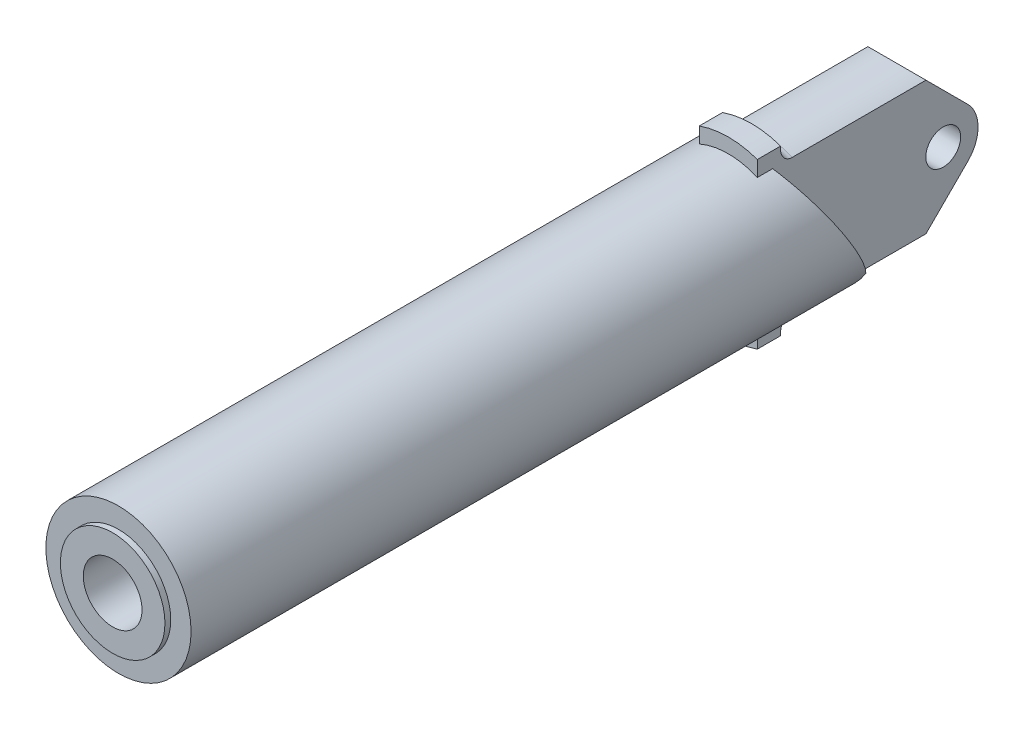
ISO-10303-21;
HEADER;
FILE_DESCRIPTION(('STEP AP214'),'2;1');
FILE_NAME('part.step','',(''),(''),'','','');
FILE_SCHEMA(('AUTOMOTIVE_DESIGN { 1 0 10303 214 1 1 1 1 }'));
ENDSEC;
DATA;
#1=APPLICATION_CONTEXT('core data for automotive mechanical design processes');
#2=APPLICATION_PROTOCOL_DEFINITION('international standard','automotive_design',2000,#1);
#3=PRODUCT_CONTEXT('',#1,'mechanical');
#4=PRODUCT('Part','Part','',(#3));
#5=PRODUCT_RELATED_PRODUCT_CATEGORY('part','',(#4));
#6=PRODUCT_DEFINITION_FORMATION('','',#4);
#7=PRODUCT_DEFINITION_CONTEXT('part definition',#1,'design');
#8=PRODUCT_DEFINITION('design','',#6,#7);
#9=PRODUCT_DEFINITION_SHAPE('','',#8);
#10=(LENGTH_UNIT() NAMED_UNIT(*) SI_UNIT(.MILLI.,.METRE.));
#11=(NAMED_UNIT(*) PLANE_ANGLE_UNIT() SI_UNIT($,.RADIAN.));
#12=(NAMED_UNIT(*) SI_UNIT($,.STERADIAN.) SOLID_ANGLE_UNIT());
#13=UNCERTAINTY_MEASURE_WITH_UNIT(LENGTH_MEASURE(1.E-05),#10,'distance_accuracy_value','');
#14=(GEOMETRIC_REPRESENTATION_CONTEXT(3) GLOBAL_UNCERTAINTY_ASSIGNED_CONTEXT((#13)) GLOBAL_UNIT_ASSIGNED_CONTEXT((#10,
#11,#12)) REPRESENTATION_CONTEXT('',''));
#15=CARTESIAN_POINT('',(0.,0.,0.));
#16=DIRECTION('',(0.,0.,1.));
#17=DIRECTION('',(1.,0.,0.));
#18=AXIS2_PLACEMENT_3D('',#15,#16,#17);
#19=CARTESIAN_POINT('',(0.,0.,34.0000000030045));
#20=DIRECTION('',(0.,0.,1.));
#21=DIRECTION('',(1.,0.,0.));
#22=AXIS2_PLACEMENT_3D('',#19,#20,#21);
#23=CONICAL_SURFACE('',#22,5.05299999827002,1.02974425750642);
#24=CARTESIAN_POINT('',(0.,0.,30.9638512880497));
#25=VERTEX_POINT('',#24);
#26=VERTEX_LOOP('',#25);
#27=FACE_BOUND('',#26,.T.);
#28=CARTESIAN_POINT('',(0.,0.,34.));
#29=DIRECTION('',(0.,0.,1.));
#30=DIRECTION('',(1.,0.,0.));
#31=AXIS2_PLACEMENT_3D('',#28,#29,#30);
#32=CIRCLE('',#31,5.053);
#33=CARTESIAN_POINT('',(5.053,0.,34.));
#34=VERTEX_POINT('',#33);
#35=EDGE_CURVE('E324',#34,#34,#32,.T.);
#36=ORIENTED_EDGE('',*,*,#35,.T.);
#37=EDGE_LOOP('',(#36));
#38=FACE_BOUND('',#37,.T.);
#39=ADVANCED_FACE('F17',(#27,#38),#23,.F.);
#40=CARTESIAN_POINT('',(0.,0.,89.));
#41=DIRECTION('',(0.,0.,1.));
#42=DIRECTION('',(1.,0.,0.));
#43=AXIS2_PLACEMENT_3D('',#40,#41,#42);
#44=CYLINDRICAL_SURFACE('',#43,5.053);
#45=ORIENTED_EDGE('',*,*,#35,.F.);
#46=EDGE_LOOP('',(#45));
#47=FACE_BOUND('',#46,.T.);
#48=CARTESIAN_POINT('',(0.,0.,144.));
#49=DIRECTION('',(0.,0.,1.));
#50=DIRECTION('',(1.,0.,0.));
#51=AXIS2_PLACEMENT_3D('',#48,#49,#50);
#52=CIRCLE('',#51,5.053);
#53=CARTESIAN_POINT('',(5.053,0.,144.));
#54=VERTEX_POINT('',#53);
#55=EDGE_CURVE('E20',#54,#54,#52,.T.);
#56=ORIENTED_EDGE('',*,*,#55,.T.);
#57=EDGE_LOOP('',(#56));
#58=FACE_BOUND('',#57,.T.);
#59=ADVANCED_FACE('F337',(#47,#58),#44,.F.);
#60=CARTESIAN_POINT('',(0.,0.,144.));
#61=DIRECTION('',(0.,0.,-1.));
#62=DIRECTION('',(-1.,0.,0.));
#63=AXIS2_PLACEMENT_3D('',#60,#61,#62);
#64=PLANE('',#63);
#65=ORIENTED_EDGE('',*,*,#55,.F.);
#66=EDGE_LOOP('',(#65));
#67=FACE_BOUND('',#66,.T.);
#68=CARTESIAN_POINT('',(0.,0.,144.));
#69=DIRECTION('',(0.,0.,1.));
#70=DIRECTION('',(1.,0.,0.));
#71=AXIS2_PLACEMENT_3D('',#68,#69,#70);
#72=CIRCLE('',#71,9.);
#73=CARTESIAN_POINT('',(9.,0.,144.));
#74=VERTEX_POINT('',#73);
#75=EDGE_CURVE('E293',#74,#74,#72,.F.);
#76=ORIENTED_EDGE('',*,*,#75,.F.);
#77=EDGE_LOOP('',(#76));
#78=FACE_BOUND('',#77,.T.);
#79=ADVANCED_FACE('F339',(#67,#78),#64,.F.);
#80=CARTESIAN_POINT('',(0.,13.2455290355381,34.));
#81=DIRECTION('',(0.,0.,1.));
#82=DIRECTION('',(1.,0.,0.));
#83=AXIS2_PLACEMENT_3D('',#80,#81,#82);
#84=PLANE('',#83);
#85=DIRECTION('',(0.,1.,0.));
#86=VECTOR('',#85,1.);
#87=CARTESIAN_POINT('',(-5.,13.2455290355381,34.));
#88=LINE('',#87,#86);
#89=CARTESIAN_POINT('',(-5.,14.1421356237309,34.));
#90=VERTEX_POINT('',#89);
#91=CARTESIAN_POINT('',(-5.,13.6106575888162,34.));
#92=VERTEX_POINT('',#91);
#93=EDGE_CURVE('E295',#90,#92,#88,.F.);
#94=ORIENTED_EDGE('',*,*,#93,.F.);
#95=CARTESIAN_POINT('',(0.,0.,34.));
#96=DIRECTION('',(0.,0.,-1.));
#97=DIRECTION('',(-1.,0.,0.));
#98=AXIS2_PLACEMENT_3D('',#95,#96,#97);
#99=CIRCLE('',#98,15.);
#100=CARTESIAN_POINT('',(5.,14.1421356237309,34.));
#101=VERTEX_POINT('',#100);
#102=EDGE_CURVE('E289',#101,#90,#99,.F.);
#103=ORIENTED_EDGE('',*,*,#102,.F.);
#104=DIRECTION('',(0.,1.,0.));
#105=VECTOR('',#104,1.);
#106=CARTESIAN_POINT('',(5.,13.2455290355381,34.));
#107=LINE('',#106,#105);
#108=CARTESIAN_POINT('',(5.,13.6106575888162,34.));
#109=VERTEX_POINT('',#108);
#110=EDGE_CURVE('E299',#109,#101,#107,.T.);
#111=ORIENTED_EDGE('',*,*,#110,.F.);
#112=CARTESIAN_POINT('',(0.,0.,34.));
#113=DIRECTION('',(0.,0.,-1.));
#114=DIRECTION('',(-0.344827586206896,0.938666040608014,0.));
#115=AXIS2_PLACEMENT_3D('',#112,#113,#114);
#116=CIRCLE('',#115,14.5);
#117=EDGE_CURVE('E292',#109,#92,#116,.F.);
#118=ORIENTED_EDGE('',*,*,#117,.T.);
#119=EDGE_LOOP('',(#94,#103,#111,#118));
#120=FACE_BOUND('',#119,.T.);
#121=ADVANCED_FACE('F342',(#120),#84,.F.);
#122=CARTESIAN_POINT('',(0.,0.,143.));
#123=DIRECTION('',(0.,0.,1.));
#124=DIRECTION('',(1.,0.,0.));
#125=AXIS2_PLACEMENT_3D('',#122,#123,#124);
#126=CYLINDRICAL_SURFACE('',#125,9.);
#127=CARTESIAN_POINT('',(0.,0.,143.));
#128=DIRECTION('',(0.,0.,1.));
#129=DIRECTION('',(1.,0.,0.));
#130=AXIS2_PLACEMENT_3D('',#127,#128,#129);
#131=CIRCLE('',#130,9.);
#132=CARTESIAN_POINT('',(9.,0.,143.));
#133=VERTEX_POINT('',#132);
#134=EDGE_CURVE('E282',#133,#133,#131,.T.);
#135=ORIENTED_EDGE('',*,*,#134,.T.);
#136=EDGE_LOOP('',(#135));
#137=FACE_BOUND('',#136,.T.);
#138=ORIENTED_EDGE('',*,*,#75,.T.);
#139=EDGE_LOOP('',(#138));
#140=FACE_BOUND('',#139,.T.);
#141=ADVANCED_FACE('F349',(#137,#140),#126,.T.);
#142=CARTESIAN_POINT('',(0.,0.,38.));
#143=DIRECTION('',(0.,0.,-1.));
#144=DIRECTION('',(-1.,0.,0.));
#145=AXIS2_PLACEMENT_3D('',#142,#143,#144);
#146=CYLINDRICAL_SURFACE('',#145,15.);
#147=CARTESIAN_POINT('',(0.,0.,38.));
#148=DIRECTION('',(0.,0.,-1.));
#149=DIRECTION('',(-1.,0.,0.));
#150=AXIS2_PLACEMENT_3D('',#147,#148,#149);
#151=CIRCLE('',#150,15.);
#152=CARTESIAN_POINT('',(-5.,-14.1421356237309,38.));
#153=VERTEX_POINT('',#152);
#154=CARTESIAN_POINT('',(5.,-14.1421356237309,38.));
#155=VERTEX_POINT('',#154);
#156=EDGE_CURVE('E278',#153,#155,#151,.F.);
#157=ORIENTED_EDGE('',*,*,#156,.F.);
#158=DIRECTION('',(0.,0.,1.));
#159=VECTOR('',#158,1.);
#160=CARTESIAN_POINT('',(-5.,-14.1421356237309,38.));
#161=LINE('',#160,#159);
#162=CARTESIAN_POINT('',(-5.,-14.1421356237309,34.));
#163=VERTEX_POINT('',#162);
#164=EDGE_CURVE('E594',#163,#153,#161,.T.);
#165=ORIENTED_EDGE('',*,*,#164,.F.);
#166=CARTESIAN_POINT('',(0.,0.,34.));
#167=DIRECTION('',(0.,0.,-1.));
#168=DIRECTION('',(-1.,0.,0.));
#169=AXIS2_PLACEMENT_3D('',#166,#167,#168);
#170=CIRCLE('',#169,15.);
#171=CARTESIAN_POINT('',(5.,-14.1421356237309,34.));
#172=VERTEX_POINT('',#171);
#173=EDGE_CURVE('E129',#163,#172,#170,.F.);
#174=ORIENTED_EDGE('',*,*,#173,.T.);
#175=DIRECTION('',(0.,0.,-1.));
#176=VECTOR('',#175,1.);
#177=CARTESIAN_POINT('',(5.,-14.1421356237309,38.));
#178=LINE('',#177,#176);
#179=EDGE_CURVE('E585',#155,#172,#178,.T.);
#180=ORIENTED_EDGE('',*,*,#179,.F.);
#181=EDGE_LOOP('',(#157,#165,#174,#180));
#182=FACE_BOUND('',#181,.T.);
#183=ADVANCED_FACE('F469',(#182),#146,.T.);
#184=CARTESIAN_POINT('',(0.,-13.2455290355381,34.));
#185=DIRECTION('',(0.,0.,1.));
#186=DIRECTION('',(1.,0.,0.));
#187=AXIS2_PLACEMENT_3D('',#184,#185,#186);
#188=PLANE('',#187);
#189=DIRECTION('',(0.,1.,0.));
#190=VECTOR('',#189,1.);
#191=CARTESIAN_POINT('',(5.,-14.1421356237309,34.));
#192=LINE('',#191,#190);
#193=CARTESIAN_POINT('',(5.,-13.6106575888162,34.));
#194=VERTEX_POINT('',#193);
#195=EDGE_CURVE('E280',#172,#194,#192,.T.);
#196=ORIENTED_EDGE('',*,*,#195,.F.);
#197=ORIENTED_EDGE('',*,*,#173,.F.);
#198=DIRECTION('',(0.,1.,0.));
#199=VECTOR('',#198,1.);
#200=CARTESIAN_POINT('',(-5.,-11.4564392373896,34.));
#201=LINE('',#200,#199);
#202=CARTESIAN_POINT('',(-5.,-13.6106575888162,34.));
#203=VERTEX_POINT('',#202);
#204=EDGE_CURVE('E285',#203,#163,#201,.F.);
#205=ORIENTED_EDGE('',*,*,#204,.F.);
#206=CARTESIAN_POINT('',(0.,0.,34.));
#207=DIRECTION('',(0.,0.,-1.));
#208=DIRECTION('',(0.344827586206897,-0.938666040608014,0.));
#209=AXIS2_PLACEMENT_3D('',#206,#207,#208);
#210=CIRCLE('',#209,14.5);
#211=EDGE_CURVE('E243',#203,#194,#210,.F.);
#212=ORIENTED_EDGE('',*,*,#211,.T.);
#213=EDGE_LOOP('',(#196,#197,#205,#212));
#214=FACE_BOUND('',#213,.T.);
#215=ADVANCED_FACE('F461',(#214),#188,.F.);
#216=CARTESIAN_POINT('',(0.,0.,6.));
#217=DIRECTION('',(1.,0.,0.));
#218=DIRECTION('',(0.,0.,-1.));
#219=AXIS2_PLACEMENT_3D('',#216,#217,#218);
#220=CYLINDRICAL_SURFACE('',#219,5.99999999999999);
#221=CARTESIAN_POINT('',(5.,0.,6.));
#222=DIRECTION('',(1.,0.,0.));
#223=DIRECTION('',(0.,0.,-1.));
#224=AXIS2_PLACEMENT_3D('',#221,#222,#223);
#225=CIRCLE('',#224,5.99999999999999);
#226=CARTESIAN_POINT('',(5.,4.24264068711928,1.75735931288071));
#227=VERTEX_POINT('',#226);
#228=CARTESIAN_POINT('',(5.,-4.24264068711928,1.75735931288072));
#229=VERTEX_POINT('',#228);
#230=EDGE_CURVE('E203',#227,#229,#225,.F.);
#231=ORIENTED_EDGE('',*,*,#230,.T.);
#232=DIRECTION('',(1.,0.,0.));
#233=VECTOR('',#232,1.);
#234=CARTESIAN_POINT('',(0.,-4.24264068711927,1.75735931288072));
#235=LINE('',#234,#233);
#236=CARTESIAN_POINT('',(-5.,-4.24264068711927,1.75735931288072));
#237=VERTEX_POINT('',#236);
#238=EDGE_CURVE('E649',#229,#237,#235,.F.);
#239=ORIENTED_EDGE('',*,*,#238,.T.);
#240=CARTESIAN_POINT('',(-5.,0.,6.));
#241=DIRECTION('',(1.,0.,0.));
#242=DIRECTION('',(0.,0.,-1.));
#243=AXIS2_PLACEMENT_3D('',#240,#241,#242);
#244=CIRCLE('',#243,5.99999999999999);
#245=CARTESIAN_POINT('',(-5.,4.24264068711928,1.75735931288071));
#246=VERTEX_POINT('',#245);
#247=EDGE_CURVE('E612',#237,#246,#244,.T.);
#248=ORIENTED_EDGE('',*,*,#247,.T.);
#249=DIRECTION('',(1.,0.,0.));
#250=VECTOR('',#249,1.);
#251=CARTESIAN_POINT('',(0.,4.24264068711928,1.75735931288071));
#252=LINE('',#251,#250);
#253=EDGE_CURVE('E288',#246,#227,#252,.T.);
#254=ORIENTED_EDGE('',*,*,#253,.T.);
#255=EDGE_LOOP('',(#231,#239,#248,#254));
#256=FACE_BOUND('',#255,.T.);
#257=ADVANCED_FACE('F454',(#256),#220,.T.);
#258=CARTESIAN_POINT('',(0.,0.,38.));
#259=DIRECTION('',(0.,0.,-1.));
#260=DIRECTION('',(-1.,0.,0.));
#261=AXIS2_PLACEMENT_3D('',#258,#259,#260);
#262=CYLINDRICAL_SURFACE('',#261,15.);
#263=CARTESIAN_POINT('',(0.,0.,38.));
#264=DIRECTION('',(0.,0.,-1.));
#265=DIRECTION('',(-1.,0.,0.));
#266=AXIS2_PLACEMENT_3D('',#263,#264,#265);
#267=CIRCLE('',#266,15.);
#268=CARTESIAN_POINT('',(5.,14.1421356237309,38.));
#269=VERTEX_POINT('',#268);
#270=CARTESIAN_POINT('',(-5.,14.1421356237309,38.));
#271=VERTEX_POINT('',#270);
#272=EDGE_CURVE('E237',#269,#271,#267,.F.);
#273=ORIENTED_EDGE('',*,*,#272,.F.);
#274=DIRECTION('',(0.,0.,1.));
#275=VECTOR('',#274,1.);
#276=CARTESIAN_POINT('',(5.,14.1421356237309,0.));
#277=LINE('',#276,#275);
#278=EDGE_CURVE('E195',#269,#101,#277,.F.);
#279=ORIENTED_EDGE('',*,*,#278,.T.);
#280=ORIENTED_EDGE('',*,*,#102,.T.);
#281=DIRECTION('',(0.,0.,-1.));
#282=VECTOR('',#281,1.);
#283=CARTESIAN_POINT('',(-5.,14.1421356237309,0.));
#284=LINE('',#283,#282);
#285=EDGE_CURVE('E601',#90,#271,#284,.F.);
#286=ORIENTED_EDGE('',*,*,#285,.T.);
#287=EDGE_LOOP('',(#273,#279,#280,#286));
#288=FACE_BOUND('',#287,.T.);
#289=ADVANCED_FACE('F448',(#288),#262,.T.);
#290=CARTESIAN_POINT('',(0.,0.,32.));
#291=DIRECTION('',(0.,0.,-1.));
#292=DIRECTION('',(-1.,0.,0.));
#293=AXIS2_PLACEMENT_3D('',#290,#291,#292);
#294=TOROIDAL_SURFACE('',#293,14.5,2.);
#295=ORIENTED_EDGE('',*,*,#117,.F.);
#296=CARTESIAN_POINT('',(5.,13.6106575888162,34.));
#297=CARTESIAN_POINT('',(5.,13.5468966708527,33.9999975430048));
#298=CARTESIAN_POINT('',(5.,13.4831675691273,33.9973121061018));
#299=CARTESIAN_POINT('',(5.,13.3561587571479,33.9866120732048));
#300=CARTESIAN_POINT('',(5.,13.2928790434602,33.9785975179741));
#301=CARTESIAN_POINT('',(5.,13.1043019111399,33.9466171384072));
#302=CARTESIAN_POINT('',(5.,12.9802554517371,33.9147145871028));
#303=CARTESIAN_POINT('',(5.,12.7392624356457,33.8304773346133));
#304=CARTESIAN_POINT('',(5.,12.6223208220204,33.7781285922937));
#305=CARTESIAN_POINT('',(5.,12.3991818269657,33.6541040620615));
#306=CARTESIAN_POINT('',(5.,12.2929794970167,33.5824372319874));
#307=CARTESIAN_POINT('',(5.,12.0973417479164,33.4232624221871));
#308=CARTESIAN_POINT('',(5.,12.0075673313835,33.3361722247259));
#309=CARTESIAN_POINT('',(5.,11.8452400671224,33.1471133692669));
#310=CARTESIAN_POINT('',(5.,11.7726849924521,33.0451466379778));
#311=CARTESIAN_POINT('',(5.,11.6525767852514,32.8369316825648));
#312=CARTESIAN_POINT('',(5.,11.60362238728,32.7314911511406));
#313=CARTESIAN_POINT('',(5.,11.5258794089757,32.513508331409));
#314=CARTESIAN_POINT('',(5.,11.497052280248,32.4009800711125));
#315=CARTESIAN_POINT('',(5.,11.4714946535357,32.2394281899142));
#316=CARTESIAN_POINT('',(5.,11.4658511099785,32.1916842418682));
#317=CARTESIAN_POINT('',(5.,11.4583267383209,32.0959690262795));
#318=CARTESIAN_POINT('',(5.,11.4564405796231,32.0479981776969));
#319=CARTESIAN_POINT('',(5.,11.4564392373896,32.));
#320=B_SPLINE_CURVE_WITH_KNOTS('',3,(#296,#297,#298,#299,#300,#301,#302,#303,#304,#305,#306,
#307,#308,#309,#310,#311,#312,#313,#314,#315,#316,#317,#318,#319),.UNSPECIFIED.,.F.,.F.,(4,2,2,
2,2,2,2,2,2,2,2,4),(0.,0.191163730210204,0.382325998195225,0.764617801777558,1.14717260180131,
1.52955031460135,1.90282410237363,2.27604958907835,2.62298174064204,2.96924760029805,
3.11335567204701,3.25725915182686),.UNSPECIFIED.);
#321=CARTESIAN_POINT('',(5.,11.4564392373896,32.));
#322=VERTEX_POINT('',#321);
#323=EDGE_CURVE('E192',#109,#322,#320,.T.);
#324=ORIENTED_EDGE('',*,*,#323,.T.);
#325=CARTESIAN_POINT('',(0.,0.,32.));
#326=DIRECTION('',(0.,0.,1.));
#327=DIRECTION('',(1.,0.,0.));
#328=AXIS2_PLACEMENT_3D('',#325,#326,#327);
#329=CIRCLE('',#328,12.5);
#330=CARTESIAN_POINT('',(-5.,11.4564392373896,32.));
#331=VERTEX_POINT('',#330);
#332=EDGE_CURVE('E597',#331,#322,#329,.F.);
#333=ORIENTED_EDGE('',*,*,#332,.F.);
#334=CARTESIAN_POINT('',(-5.,11.4564392373896,32.));
#335=CARTESIAN_POINT('',(-5.,11.4564304085411,32.0530346313303));
#336=CARTESIAN_POINT('',(-5.,11.458740702365,32.106064923116));
#337=CARTESIAN_POINT('',(-5.,11.4679317672374,32.2117152954959));
#338=CARTESIAN_POINT('',(-5.,11.4748114160961,32.2643354736005));
#339=CARTESIAN_POINT('',(-5.,11.4930444847472,32.3686246369326));
#340=CARTESIAN_POINT('',(-5.,11.504383626757,32.4202961123279));
#341=CARTESIAN_POINT('',(-5.,11.5313978396076,32.5224792645873));
#342=CARTESIAN_POINT('',(-5.,11.5470730288118,32.57299090975));
#343=CARTESIAN_POINT('',(-5.,11.600355201599,32.7222137935305));
#344=CARTESIAN_POINT('',(-5.,11.6442446276126,32.8187581715649));
#345=CARTESIAN_POINT('',(-5.,11.7470204492462,33.0034595344621));
#346=CARTESIAN_POINT('',(-5.,11.8059151353975,33.0916118455325));
#347=CARTESIAN_POINT('',(-5.,11.9391480857162,33.260809356467));
#348=CARTESIAN_POINT('',(-5.,12.0139839333843,33.3414624932931));
#349=CARTESIAN_POINT('',(-5.,12.1752540492434,33.4901705289463));
#350=CARTESIAN_POINT('',(-5.,12.2616918333641,33.5582215938207));
#351=CARTESIAN_POINT('',(-5.,12.4508895204671,33.6853271844896));
#352=CARTESIAN_POINT('',(-5.,12.5543959908048,33.7432705544042));
#353=CARTESIAN_POINT('',(-5.,12.769255783192,33.8421200577179));
#354=CARTESIAN_POINT('',(-5.,12.8806107829497,33.883022535449));
#355=CARTESIAN_POINT('',(-5.,13.0946290904793,33.9431827390289));
#356=CARTESIAN_POINT('',(-5.,13.1967345119595,33.9644471168061));
#357=CARTESIAN_POINT('',(-5.,13.4027717958483,33.9928590281403));
#358=CARTESIAN_POINT('',(-5.,13.5067014566854,34.0000225365941));
#359=CARTESIAN_POINT('',(-5.,13.6106575888162,34.));
#360=B_SPLINE_CURVE_WITH_KNOTS('',3,(#334,#335,#336,#337,#338,#339,#340,#341,#342,#343,#344,
#345,#346,#347,#348,#349,#350,#351,#352,#353,#354,#355,#356,#357,#358,#359),.UNSPECIFIED.,.F.,
.F.,(4,2,2,2,2,2,2,2,2,2,2,2,4),(0.,0.15904623246959,0.318053419143773,0.476555609864902,
0.635062127733801,0.95163834159218,1.26838984719524,1.59705603867599,1.92582205722875,
2.28015470514148,2.63456332656375,2.94649450248333,3.25807208723595),.UNSPECIFIED.);
#361=EDGE_CURVE('E235',#331,#92,#360,.T.);
#362=ORIENTED_EDGE('',*,*,#361,.T.);
#363=EDGE_LOOP('',(#295,#324,#333,#362));
#364=FACE_BOUND('',#363,.T.);
#365=ADVANCED_FACE('F205',(#364),#294,.F.);
#366=CARTESIAN_POINT('',(0.,0.,0.));
#367=DIRECTION('',(0.,0.,1.));
#368=DIRECTION('',(1.,0.,0.));
#369=AXIS2_PLACEMENT_3D('',#366,#367,#368);
#370=CYLINDRICAL_SURFACE('',#369,12.5);
#371=CARTESIAN_POINT('',(0.,0.,-2.48528137423858));
#372=DIRECTION('',(0.,-0.707106781186548,0.707106781186547));
#373=DIRECTION('',(0.,0.707106781186547,0.707106781186548));
#374=AXIS2_PLACEMENT_3D('',#371,#372,#373);
#375=ELLIPSE('',#374,17.6776695296637,12.5);
#376=CARTESIAN_POINT('',(5.,11.4564392373896,8.97115786315104));
#377=VERTEX_POINT('',#376);
#378=CARTESIAN_POINT('',(-5.,11.4564392373896,8.97115786315104));
#379=VERTEX_POINT('',#378);
#380=EDGE_CURVE('E286',#377,#379,#375,.T.);
#381=ORIENTED_EDGE('',*,*,#380,.T.);
#382=DIRECTION('',(0.,0.,-1.));
#383=VECTOR('',#382,1.);
#384=CARTESIAN_POINT('',(-5.,11.4564392373896,0.));
#385=LINE('',#384,#383);
#386=EDGE_CURVE('E602',#379,#331,#385,.F.);
#387=ORIENTED_EDGE('',*,*,#386,.T.);
#388=ORIENTED_EDGE('',*,*,#332,.T.);
#389=DIRECTION('',(0.,0.,1.));
#390=VECTOR('',#389,1.);
#391=CARTESIAN_POINT('',(5.,11.4564392373896,0.));
#392=LINE('',#391,#390);
#393=EDGE_CURVE('E194',#322,#377,#392,.F.);
#394=ORIENTED_EDGE('',*,*,#393,.T.);
#395=EDGE_LOOP('',(#381,#387,#388,#394));
#396=FACE_BOUND('',#395,.T.);
#397=ADVANCED_FACE('F434',(#396),#370,.T.);
#398=CARTESIAN_POINT('',(0.,4.24264068711928,1.75735931288071));
#399=DIRECTION('',(0.,-0.707106781186548,0.707106781186547));
#400=DIRECTION('',(0.,-0.707106781186547,-0.707106781186548));
#401=AXIS2_PLACEMENT_3D('',#398,#399,#400);
#402=PLANE('',#401);
#403=ORIENTED_EDGE('',*,*,#380,.F.);
#404=DIRECTION('',(0.,-0.707106781186547,-0.707106781186547));
#405=VECTOR('',#404,1.);
#406=CARTESIAN_POINT('',(5.,11.4564392373896,8.97115786315103));
#407=LINE('',#406,#405);
#408=EDGE_CURVE('E191',#377,#227,#407,.T.);
#409=ORIENTED_EDGE('',*,*,#408,.T.);
#410=ORIENTED_EDGE('',*,*,#253,.F.);
#411=DIRECTION('',(0.,0.707106781186548,0.707106781186548));
#412=VECTOR('',#411,1.);
#413=CARTESIAN_POINT('',(-5.,4.24264068711928,1.75735931288071));
#414=LINE('',#413,#412);
#415=EDGE_CURVE('E608',#246,#379,#414,.T.);
#416=ORIENTED_EDGE('',*,*,#415,.T.);
#417=EDGE_LOOP('',(#403,#409,#410,#416));
#418=FACE_BOUND('',#417,.T.);
#419=ADVANCED_FACE('F427',(#418),#402,.F.);
#420=CARTESIAN_POINT('',(142.305804366291,0.,6.));
#421=DIRECTION('',(-1.,0.,0.));
#422=DIRECTION('',(0.,-1.,0.));
#423=AXIS2_PLACEMENT_3D('',#420,#421,#422);
#424=CYLINDRICAL_SURFACE('',#423,3.);
#425=CARTESIAN_POINT('',(-5.,0.,6.));
#426=DIRECTION('',(-1.,0.,0.));
#427=DIRECTION('',(0.,-1.,0.));
#428=AXIS2_PLACEMENT_3D('',#425,#426,#427);
#429=CIRCLE('',#428,3.);
#430=CARTESIAN_POINT('',(-5.00000000000001,-3.,6.));
#431=VERTEX_POINT('',#430);
#432=EDGE_CURVE('E651',#431,#431,#429,.T.);
#433=ORIENTED_EDGE('',*,*,#432,.T.);
#434=EDGE_LOOP('',(#433));
#435=FACE_BOUND('',#434,.T.);
#436=CARTESIAN_POINT('',(5.,0.,6.));
#437=DIRECTION('',(-1.,0.,0.));
#438=DIRECTION('',(0.,-1.,0.));
#439=AXIS2_PLACEMENT_3D('',#436,#437,#438);
#440=CIRCLE('',#439,3.);
#441=CARTESIAN_POINT('',(5.,-3.,6.));
#442=VERTEX_POINT('',#441);
#443=EDGE_CURVE('E188',#442,#442,#440,.F.);
#444=ORIENTED_EDGE('',*,*,#443,.T.);
#445=EDGE_LOOP('',(#444));
#446=FACE_BOUND('',#445,.T.);
#447=ADVANCED_FACE('F420',(#435,#446),#424,.F.);
#448=CARTESIAN_POINT('',(0.,0.,143.));
#449=DIRECTION('',(0.,0.,-1.));
#450=DIRECTION('',(-1.,0.,0.));
#451=AXIS2_PLACEMENT_3D('',#448,#449,#450);
#452=PLANE('',#451);
#453=ORIENTED_EDGE('',*,*,#134,.F.);
#454=EDGE_LOOP('',(#453));
#455=FACE_BOUND('',#454,.T.);
#456=CARTESIAN_POINT('',(0.,0.,143.));
#457=DIRECTION('',(0.,0.,1.));
#458=DIRECTION('',(1.,0.,0.));
#459=AXIS2_PLACEMENT_3D('',#456,#457,#458);
#460=CIRCLE('',#459,12.5);
#461=CARTESIAN_POINT('',(12.5,0.,143.));
#462=VERTEX_POINT('',#461);
#463=EDGE_CURVE('E185',#462,#462,#460,.F.);
#464=ORIENTED_EDGE('',*,*,#463,.F.);
#465=EDGE_LOOP('',(#464));
#466=FACE_BOUND('',#465,.T.);
#467=ADVANCED_FACE('F270',(#455,#466),#452,.F.);
#468=CARTESIAN_POINT('',(-5.,-11.4564392373896,38.));
#469=DIRECTION('',(-1.,0.,0.));
#470=DIRECTION('',(0.,0.,1.));
#471=AXIS2_PLACEMENT_3D('',#468,#469,#470);
#472=PLANE('',#471);
#473=DIRECTION('',(0.,0.,1.));
#474=VECTOR('',#473,1.);
#475=CARTESIAN_POINT('',(-5.,-11.4564392373896,0.));
#476=LINE('',#475,#474);
#477=CARTESIAN_POINT('',(-5.,-11.4564392373896,32.));
#478=VERTEX_POINT('',#477);
#479=CARTESIAN_POINT('',(-5.,-11.4564392373896,38.));
#480=VERTEX_POINT('',#479);
#481=EDGE_CURVE('E184',#478,#480,#476,.T.);
#482=ORIENTED_EDGE('',*,*,#481,.F.);
#483=CARTESIAN_POINT('',(-4.99999999999999,-11.4564392373896,32.));
#484=CARTESIAN_POINT('',(-5.,-11.4564304085411,32.0530346313303));
#485=CARTESIAN_POINT('',(-5.,-11.458740702365,32.106064923116));
#486=CARTESIAN_POINT('',(-5.,-11.4679317672374,32.2117152954959));
#487=CARTESIAN_POINT('',(-5.,-11.4748114160961,32.2643354736005));
#488=CARTESIAN_POINT('',(-5.,-11.4930444847472,32.3686246369326));
#489=CARTESIAN_POINT('',(-5.,-11.504383626757,32.4202961123279));
#490=CARTESIAN_POINT('',(-5.,-11.5313978396076,32.5224792645873));
#491=CARTESIAN_POINT('',(-5.,-11.5470730288118,32.57299090975));
#492=CARTESIAN_POINT('',(-4.99999999999999,-11.600355201599,32.7222137935304));
#493=CARTESIAN_POINT('',(-5.,-11.6442446276126,32.8187581715649));
#494=CARTESIAN_POINT('',(-5.,-11.7470204492462,33.0034595344621));
#495=CARTESIAN_POINT('',(-5.,-11.8059151353975,33.0916118455325));
#496=CARTESIAN_POINT('',(-5.,-11.9391480857162,33.260809356467));
#497=CARTESIAN_POINT('',(-5.,-12.0139839333843,33.3414624932931));
#498=CARTESIAN_POINT('',(-5.,-12.1752540492434,33.4901705289463));
#499=CARTESIAN_POINT('',(-5.,-12.2616918333642,33.5582215938207));
#500=CARTESIAN_POINT('',(-5.,-12.4508895204672,33.6853271844896));
#501=CARTESIAN_POINT('',(-5.,-12.5543959908048,33.7432705544041));
#502=CARTESIAN_POINT('',(-5.,-12.769255783192,33.8421200577178));
#503=CARTESIAN_POINT('',(-5.,-12.8806107829497,33.883022535449));
#504=CARTESIAN_POINT('',(-5.,-13.0946290904793,33.9431827390289));
#505=CARTESIAN_POINT('',(-5.,-13.1967345119595,33.964447116806));
#506=CARTESIAN_POINT('',(-5.,-13.4027717958483,33.9928590281402));
#507=CARTESIAN_POINT('',(-5.,-13.5067014566854,34.0000225365941));
#508=CARTESIAN_POINT('',(-5.,-13.6106575888162,34.));
#509=B_SPLINE_CURVE_WITH_KNOTS('',3,(#483,#484,#485,#486,#487,#488,#489,#490,#491,#492,#493,
#494,#495,#496,#497,#498,#499,#500,#501,#502,#503,#504,#505,#506,#507,#508),.UNSPECIFIED.,.F.,
.F.,(4,2,2,2,2,2,2,2,2,2,2,2,4),(0.,0.15904623246959,0.318053419143773,0.476555609864903,
0.635062127733802,0.951638341592188,1.26838984719525,1.597056038676,1.92582205722876,
2.28015470514149,2.63456332656376,2.94649450248333,3.25807208723595),.UNSPECIFIED.);
#510=EDGE_CURVE('E251',#478,#203,#509,.T.);
#511=ORIENTED_EDGE('',*,*,#510,.T.);
#512=ORIENTED_EDGE('',*,*,#204,.T.);
#513=ORIENTED_EDGE('',*,*,#164,.T.);
#514=DIRECTION('',(0.,1.,0.));
#515=VECTOR('',#514,1.);
#516=CARTESIAN_POINT('',(-5.,-13.2455290355381,38.));
#517=LINE('',#516,#515);
#518=EDGE_CURVE('E281',#480,#153,#517,.F.);
#519=ORIENTED_EDGE('',*,*,#518,.F.);
#520=EDGE_LOOP('',(#482,#511,#512,#513,#519));
#521=FACE_BOUND('',#520,.T.);
#522=ADVANCED_FACE('F265',(#521),#472,.T.);
#523=CARTESIAN_POINT('',(0.,-13.2455290355381,38.));
#524=DIRECTION('',(0.,0.,1.));
#525=DIRECTION('',(1.,0.,0.));
#526=AXIS2_PLACEMENT_3D('',#523,#524,#525);
#527=PLANE('',#526);
#528=ORIENTED_EDGE('',*,*,#156,.T.);
#529=DIRECTION('',(0.,1.,0.));
#530=VECTOR('',#529,1.);
#531=CARTESIAN_POINT('',(5.,-14.1421356237309,38.));
#532=LINE('',#531,#530);
#533=CARTESIAN_POINT('',(5.,-11.4564392373896,38.));
#534=VERTEX_POINT('',#533);
#535=EDGE_CURVE('E593',#534,#155,#532,.F.);
#536=ORIENTED_EDGE('',*,*,#535,.F.);
#537=CARTESIAN_POINT('',(0.,0.,38.));
#538=DIRECTION('',(0.,0.,1.));
#539=DIRECTION('',(1.,0.,0.));
#540=AXIS2_PLACEMENT_3D('',#537,#538,#539);
#541=CIRCLE('',#540,12.5);
#542=EDGE_CURVE('E180',#480,#534,#541,.T.);
#543=ORIENTED_EDGE('',*,*,#542,.F.);
#544=ORIENTED_EDGE('',*,*,#518,.T.);
#545=EDGE_LOOP('',(#528,#536,#543,#544));
#546=FACE_BOUND('',#545,.T.);
#547=ADVANCED_FACE('F261',(#546),#527,.T.);
#548=CARTESIAN_POINT('',(5.,-14.1421356237309,38.));
#549=DIRECTION('',(1.,0.,0.));
#550=DIRECTION('',(0.,0.,-1.));
#551=AXIS2_PLACEMENT_3D('',#548,#549,#550);
#552=PLANE('',#551);
#553=ORIENTED_EDGE('',*,*,#535,.T.);
#554=ORIENTED_EDGE('',*,*,#179,.T.);
#555=ORIENTED_EDGE('',*,*,#195,.T.);
#556=CARTESIAN_POINT('',(5.,-13.6106575888162,34.));
#557=CARTESIAN_POINT('',(5.,-13.5468966708527,33.9999975430047));
#558=CARTESIAN_POINT('',(5.,-13.4831675691273,33.9973121061018));
#559=CARTESIAN_POINT('',(5.,-13.3561587571479,33.9866120732048));
#560=CARTESIAN_POINT('',(5.,-13.2928790434601,33.9785975179741));
#561=CARTESIAN_POINT('',(5.,-13.1043019111399,33.9466171384072));
#562=CARTESIAN_POINT('',(5.,-12.9802554517371,33.9147145871028));
#563=CARTESIAN_POINT('',(5.,-12.7392624356457,33.8304773346133));
#564=CARTESIAN_POINT('',(5.,-12.6223208220204,33.7781285922937));
#565=CARTESIAN_POINT('',(5.,-12.3991818269657,33.6541040620615));
#566=CARTESIAN_POINT('',(5.,-12.2929794970167,33.5824372319874));
#567=CARTESIAN_POINT('',(5.,-12.0973417479164,33.4232624221871));
#568=CARTESIAN_POINT('',(5.,-12.0075673313835,33.3361722247259));
#569=CARTESIAN_POINT('',(5.,-11.8452400671224,33.1471133692669));
#570=CARTESIAN_POINT('',(5.,-11.7726849924521,33.0451466379778));
#571=CARTESIAN_POINT('',(5.,-11.6525767852514,32.8369316825648));
#572=CARTESIAN_POINT('',(5.,-11.60362238728,32.7314911511406));
#573=CARTESIAN_POINT('',(5.,-11.5258794089757,32.5135083314089));
#574=CARTESIAN_POINT('',(4.99999999999999,-11.497052280248,32.4009800711125));
#575=CARTESIAN_POINT('',(4.99999999999999,-11.4714946535357,32.2394281899142));
#576=CARTESIAN_POINT('',(5.,-11.4658511099785,32.1916842418682));
#577=CARTESIAN_POINT('',(5.,-11.4583267383209,32.0959690262794));
#578=CARTESIAN_POINT('',(5.,-11.4564405796231,32.0479981776968));
#579=CARTESIAN_POINT('',(5.,-11.4564392373896,32.));
#580=B_SPLINE_CURVE_WITH_KNOTS('',3,(#556,#557,#558,#559,#560,#561,#562,#563,#564,#565,#566,
#567,#568,#569,#570,#571,#572,#573,#574,#575,#576,#577,#578,#579),.UNSPECIFIED.,.F.,.F.,(4,2,2,
2,2,2,2,2,2,2,2,4),(0.,0.191163730210204,0.382325998195225,0.76461780177756,1.14717260180132,
1.52955031460135,1.90282410237363,2.27604958907835,2.62298174064204,2.96924760029805,
3.11335567204701,3.25725915182686),.UNSPECIFIED.);
#581=CARTESIAN_POINT('',(5.,-11.4564392373896,32.));
#582=VERTEX_POINT('',#581);
#583=EDGE_CURVE('E241',#194,#582,#580,.T.);
#584=ORIENTED_EDGE('',*,*,#583,.T.);
#585=DIRECTION('',(0.,0.,1.));
#586=VECTOR('',#585,1.);
#587=CARTESIAN_POINT('',(5.,-11.4564392373896,0.));
#588=LINE('',#587,#586);
#589=EDGE_CURVE('E183',#534,#582,#588,.F.);
#590=ORIENTED_EDGE('',*,*,#589,.F.);
#591=EDGE_LOOP('',(#553,#554,#555,#584,#590));
#592=FACE_BOUND('',#591,.T.);
#593=ADVANCED_FACE('F257',(#592),#552,.T.);
#594=CARTESIAN_POINT('',(0.,0.,32.));
#595=DIRECTION('',(0.,0.,-1.));
#596=DIRECTION('',(-1.,0.,0.));
#597=AXIS2_PLACEMENT_3D('',#594,#595,#596);
#598=TOROIDAL_SURFACE('',#597,14.5,2.);
#599=ORIENTED_EDGE('',*,*,#211,.F.);
#600=ORIENTED_EDGE('',*,*,#510,.F.);
#601=CARTESIAN_POINT('',(0.,0.,32.));
#602=DIRECTION('',(0.,0.,1.));
#603=DIRECTION('',(1.,0.,0.));
#604=AXIS2_PLACEMENT_3D('',#601,#602,#603);
#605=CIRCLE('',#604,12.5);
#606=EDGE_CURVE('E152',#582,#478,#605,.F.);
#607=ORIENTED_EDGE('',*,*,#606,.F.);
#608=ORIENTED_EDGE('',*,*,#583,.F.);
#609=EDGE_LOOP('',(#599,#600,#607,#608));
#610=FACE_BOUND('',#609,.T.);
#611=ADVANCED_FACE('F253',(#610),#598,.F.);
#612=CARTESIAN_POINT('',(0.,13.2455290355381,38.));
#613=DIRECTION('',(0.,0.,1.));
#614=DIRECTION('',(1.,0.,0.));
#615=AXIS2_PLACEMENT_3D('',#612,#613,#614);
#616=PLANE('',#615);
#617=ORIENTED_EDGE('',*,*,#272,.T.);
#618=DIRECTION('',(0.,1.,0.));
#619=VECTOR('',#618,1.);
#620=CARTESIAN_POINT('',(-5.,11.4564392373896,38.));
#621=LINE('',#620,#619);
#622=CARTESIAN_POINT('',(-5.,11.4564392373896,38.));
#623=VERTEX_POINT('',#622);
#624=EDGE_CURVE('E603',#271,#623,#621,.F.);
#625=ORIENTED_EDGE('',*,*,#624,.T.);
#626=CARTESIAN_POINT('',(0.,0.,38.));
#627=DIRECTION('',(0.,0.,1.));
#628=DIRECTION('',(1.,0.,0.));
#629=AXIS2_PLACEMENT_3D('',#626,#627,#628);
#630=CIRCLE('',#629,12.5);
#631=CARTESIAN_POINT('',(5.,11.4564392373896,38.));
#632=VERTEX_POINT('',#631);
#633=EDGE_CURVE('E151',#632,#623,#630,.T.);
#634=ORIENTED_EDGE('',*,*,#633,.F.);
#635=DIRECTION('',(0.,1.,0.));
#636=VECTOR('',#635,1.);
#637=CARTESIAN_POINT('',(5.,-11.4564392373896,38.));
#638=LINE('',#637,#636);
#639=EDGE_CURVE('E147',#632,#269,#638,.T.);
#640=ORIENTED_EDGE('',*,*,#639,.T.);
#641=EDGE_LOOP('',(#617,#625,#634,#640));
#642=FACE_BOUND('',#641,.T.);
#643=ADVANCED_FACE('F389',(#642),#616,.T.);
#644=CARTESIAN_POINT('',(-5.,22.4945672822897,41.7400212254666));
#645=DIRECTION('',(0.,-0.5,0.866025403784439));
#646=DIRECTION('',(0.,-0.866025403784439,-0.5));
#647=AXIS2_PLACEMENT_3D('',#644,#645,#646);
#648=PLANE('',#647);
#649=DIRECTION('',(0.,-0.866025403784439,-0.5));
#650=VECTOR('',#649,1.);
#651=CARTESIAN_POINT('',(-5.,11.4564392373896,35.367155027394));
#652=LINE('',#651,#650);
#653=CARTESIAN_POINT('',(-5.,11.4564392373896,35.367155027394));
#654=VERTEX_POINT('',#653);
#655=CARTESIAN_POINT('',(-5.,-6.5,25.));
#656=VERTEX_POINT('',#655);
#657=EDGE_CURVE('E613',#654,#656,#652,.T.);
#658=ORIENTED_EDGE('',*,*,#657,.T.);
#659=DIRECTION('',(1.,0.,0.));
#660=VECTOR('',#659,1.);
#661=CARTESIAN_POINT('',(-7.45630959221067,-6.5,25.));
#662=LINE('',#661,#660);
#663=CARTESIAN_POINT('',(-10.6770782520313,-6.49999999999999,25.));
#664=VERTEX_POINT('',#663);
#665=EDGE_CURVE('E240',#656,#664,#662,.F.);
#666=ORIENTED_EDGE('',*,*,#665,.T.);
#667=CARTESIAN_POINT('',(0.,0.,28.7527767497326));
#668=DIRECTION('',(0.,-0.5,0.866025403784439));
#669=DIRECTION('',(0.,0.866025403784439,0.5));
#670=AXIS2_PLACEMENT_3D('',#667,#668,#669);
#671=ELLIPSE('',#670,14.4337567297406,12.5);
#672=EDGE_CURVE('E175',#654,#664,#671,.T.);
#673=ORIENTED_EDGE('',*,*,#672,.F.);
#674=EDGE_LOOP('',(#658,#666,#673));
#675=FACE_BOUND('',#674,.T.);
#676=ADVANCED_FACE('F382',(#675),#648,.F.);
#677=CARTESIAN_POINT('',(-7.45630959221067,0.,25.));
#678=DIRECTION('',(0.,0.,1.));
#679=DIRECTION('',(1.,0.,0.));
#680=AXIS2_PLACEMENT_3D('',#677,#678,#679);
#681=PLANE('',#680);
#682=DIRECTION('',(0.,1.,0.));
#683=VECTOR('',#682,1.);
#684=CARTESIAN_POINT('',(-5.,11.4564392373896,25.));
#685=LINE('',#684,#683);
#686=CARTESIAN_POINT('',(-5.,-11.4564392373896,25.));
#687=VERTEX_POINT('',#686);
#688=EDGE_CURVE('E610',#656,#687,#685,.F.);
#689=ORIENTED_EDGE('',*,*,#688,.T.);
#690=CARTESIAN_POINT('',(0.,0.,25.));
#691=DIRECTION('',(0.,0.,1.));
#692=DIRECTION('',(1.,0.,0.));
#693=AXIS2_PLACEMENT_3D('',#690,#691,#692);
#694=CIRCLE('',#693,12.5);
#695=EDGE_CURVE('E172',#664,#687,#694,.T.);
#696=ORIENTED_EDGE('',*,*,#695,.F.);
#697=ORIENTED_EDGE('',*,*,#665,.F.);
#698=EDGE_LOOP('',(#689,#696,#697));
#699=FACE_BOUND('',#698,.T.);
#700=ADVANCED_FACE('F225',(#699),#681,.F.);
#701=CARTESIAN_POINT('',(-5.,11.4564392373896,0.));
#702=DIRECTION('',(1.,0.,0.));
#703=DIRECTION('',(0.,0.,-1.));
#704=AXIS2_PLACEMENT_3D('',#701,#702,#703);
#705=PLANE('',#704);
#706=ORIENTED_EDGE('',*,*,#432,.F.);
#707=EDGE_LOOP('',(#706));
#708=FACE_BOUND('',#707,.T.);
#709=ORIENTED_EDGE('',*,*,#247,.F.);
#710=DIRECTION('',(0.,-0.707106781186548,0.707106781186547));
#711=VECTOR('',#710,1.);
#712=CARTESIAN_POINT('',(-5.,-15.9935366705811,13.5082552963426));
#713=LINE('',#712,#711);
#714=CARTESIAN_POINT('',(-5.,-11.4564392373896,8.97115786315104));
#715=VERTEX_POINT('',#714);
#716=EDGE_CURVE('E650',#237,#715,#713,.T.);
#717=ORIENTED_EDGE('',*,*,#716,.T.);
#718=DIRECTION('',(0.,0.,1.));
#719=VECTOR('',#718,1.);
#720=CARTESIAN_POINT('',(-5.,-11.4564392373896,0.));
#721=LINE('',#720,#719);
#722=EDGE_CURVE('E171',#687,#715,#721,.F.);
#723=ORIENTED_EDGE('',*,*,#722,.F.);
#724=ORIENTED_EDGE('',*,*,#688,.F.);
#725=ORIENTED_EDGE('',*,*,#657,.F.);
#726=DIRECTION('',(0.,0.,1.));
#727=VECTOR('',#726,1.);
#728=CARTESIAN_POINT('',(-5.,11.4564392373896,0.));
#729=LINE('',#728,#727);
#730=EDGE_CURVE('E178',#623,#654,#729,.F.);
#731=ORIENTED_EDGE('',*,*,#730,.F.);
#732=ORIENTED_EDGE('',*,*,#624,.F.);
#733=ORIENTED_EDGE('',*,*,#285,.F.);
#734=ORIENTED_EDGE('',*,*,#93,.T.);
#735=ORIENTED_EDGE('',*,*,#361,.F.);
#736=ORIENTED_EDGE('',*,*,#386,.F.);
#737=ORIENTED_EDGE('',*,*,#415,.F.);
#738=EDGE_LOOP('',(#709,#717,#723,#724,#725,#731,#732,#733,#734,#735,#736,#737));
#739=FACE_BOUND('',#738,.T.);
#740=ADVANCED_FACE('F220',(#708,#739),#705,.F.);
#741=CARTESIAN_POINT('',(0.,-15.9935366705811,13.5082552963426));
#742=DIRECTION('',(0.,0.707106781186547,0.707106781186548));
#743=DIRECTION('',(0.,-0.707106781186548,0.707106781186547));
#744=AXIS2_PLACEMENT_3D('',#741,#742,#743);
#745=PLANE('',#744);
#746=ORIENTED_EDGE('',*,*,#238,.F.);
#747=DIRECTION('',(0.,-0.707106781186548,0.707106781186547));
#748=VECTOR('',#747,1.);
#749=CARTESIAN_POINT('',(5.,-4.24264068711928,1.75735931288072));
#750=LINE('',#749,#748);
#751=CARTESIAN_POINT('',(5.,-11.4564392373896,8.97115786315104));
#752=VERTEX_POINT('',#751);
#753=EDGE_CURVE('E623',#229,#752,#750,.T.);
#754=ORIENTED_EDGE('',*,*,#753,.T.);
#755=CARTESIAN_POINT('',(0.,0.,-2.48528137423855));
#756=DIRECTION('',(0.,0.707106781186547,0.707106781186548));
#757=DIRECTION('',(0.,-0.707106781186548,0.707106781186547));
#758=AXIS2_PLACEMENT_3D('',#755,#756,#757);
#759=ELLIPSE('',#758,17.6776695296637,12.5);
#760=EDGE_CURVE('E166',#715,#752,#759,.T.);
#761=ORIENTED_EDGE('',*,*,#760,.F.);
#762=ORIENTED_EDGE('',*,*,#716,.F.);
#763=EDGE_LOOP('',(#746,#754,#761,#762));
#764=FACE_BOUND('',#763,.T.);
#765=ADVANCED_FACE('F215',(#764),#745,.F.);
#766=CARTESIAN_POINT('',(5.,-11.4564392373896,0.));
#767=DIRECTION('',(-1.,0.,0.));
#768=DIRECTION('',(0.,0.,1.));
#769=AXIS2_PLACEMENT_3D('',#766,#767,#768);
#770=PLANE('',#769);
#771=ORIENTED_EDGE('',*,*,#443,.F.);
#772=EDGE_LOOP('',(#771));
#773=FACE_BOUND('',#772,.T.);
#774=ORIENTED_EDGE('',*,*,#393,.F.);
#775=ORIENTED_EDGE('',*,*,#323,.F.);
#776=ORIENTED_EDGE('',*,*,#110,.T.);
#777=ORIENTED_EDGE('',*,*,#278,.F.);
#778=ORIENTED_EDGE('',*,*,#639,.F.);
#779=DIRECTION('',(0.,0.,1.));
#780=VECTOR('',#779,1.);
#781=CARTESIAN_POINT('',(5.,11.4564392373896,0.));
#782=LINE('',#781,#780);
#783=CARTESIAN_POINT('',(5.,11.4564392373896,35.3671550273941));
#784=VERTEX_POINT('',#783);
#785=EDGE_CURVE('E140',#784,#632,#782,.T.);
#786=ORIENTED_EDGE('',*,*,#785,.F.);
#787=DIRECTION('',(0.,-0.866025403784438,-0.5));
#788=VECTOR('',#787,1.);
#789=CARTESIAN_POINT('',(5.,-6.5,25.));
#790=LINE('',#789,#788);
#791=CARTESIAN_POINT('',(5.,-6.5,25.));
#792=VERTEX_POINT('',#791);
#793=EDGE_CURVE('E144',#784,#792,#790,.T.);
#794=ORIENTED_EDGE('',*,*,#793,.T.);
#795=DIRECTION('',(0.,1.,0.));
#796=VECTOR('',#795,1.);
#797=CARTESIAN_POINT('',(5.,0.,25.));
#798=LINE('',#797,#796);
#799=CARTESIAN_POINT('',(5.,-11.4564392373896,25.));
#800=VERTEX_POINT('',#799);
#801=EDGE_CURVE('E157',#792,#800,#798,.F.);
#802=ORIENTED_EDGE('',*,*,#801,.T.);
#803=DIRECTION('',(0.,0.,1.));
#804=VECTOR('',#803,1.);
#805=CARTESIAN_POINT('',(5.,-11.4564392373896,0.));
#806=LINE('',#805,#804);
#807=EDGE_CURVE('E164',#752,#800,#806,.T.);
#808=ORIENTED_EDGE('',*,*,#807,.F.);
#809=ORIENTED_EDGE('',*,*,#753,.F.);
#810=ORIENTED_EDGE('',*,*,#230,.F.);
#811=ORIENTED_EDGE('',*,*,#408,.F.);
#812=EDGE_LOOP('',(#774,#775,#776,#777,#778,#786,#794,#802,#808,#809,#810,#811));
#813=FACE_BOUND('',#812,.T.);
#814=ADVANCED_FACE('F143',(#773,#813),#770,.F.);
#815=CARTESIAN_POINT('',(7.45630959221067,0.,25.));
#816=DIRECTION('',(0.,0.,1.));
#817=DIRECTION('',(1.,0.,0.));
#818=AXIS2_PLACEMENT_3D('',#815,#816,#817);
#819=PLANE('',#818);
#820=CARTESIAN_POINT('',(0.,0.,25.));
#821=DIRECTION('',(0.,0.,1.));
#822=DIRECTION('',(1.,0.,0.));
#823=AXIS2_PLACEMENT_3D('',#820,#821,#822);
#824=CIRCLE('',#823,12.5);
#825=CARTESIAN_POINT('',(10.6770782520313,-6.5,25.));
#826=VERTEX_POINT('',#825);
#827=EDGE_CURVE('E26',#800,#826,#824,.T.);
#828=ORIENTED_EDGE('',*,*,#827,.F.);
#829=ORIENTED_EDGE('',*,*,#801,.F.);
#830=DIRECTION('',(1.,0.,0.));
#831=VECTOR('',#830,1.);
#832=CARTESIAN_POINT('',(5.,-6.5,25.));
#833=LINE('',#832,#831);
#834=EDGE_CURVE('E35',#792,#826,#833,.T.);
#835=ORIENTED_EDGE('',*,*,#834,.T.);
#836=EDGE_LOOP('',(#828,#829,#835));
#837=FACE_BOUND('',#836,.T.);
#838=ADVANCED_FACE('F214',(#837),#819,.F.);
#839=CARTESIAN_POINT('',(5.,-6.5,25.));
#840=DIRECTION('',(0.,-0.5,0.866025403784438));
#841=DIRECTION('',(0.,-0.866025403784438,-0.5));
#842=AXIS2_PLACEMENT_3D('',#839,#840,#841);
#843=PLANE('',#842);
#844=ORIENTED_EDGE('',*,*,#834,.F.);
#845=ORIENTED_EDGE('',*,*,#793,.F.);
#846=CARTESIAN_POINT('',(0.,0.,28.7527767497326));
#847=DIRECTION('',(0.,-0.5,0.866025403784438));
#848=DIRECTION('',(0.,0.866025403784438,0.5));
#849=AXIS2_PLACEMENT_3D('',#846,#847,#848);
#850=ELLIPSE('',#849,14.4337567297406,12.5);
#851=EDGE_CURVE('E11',#826,#784,#850,.T.);
#852=ORIENTED_EDGE('',*,*,#851,.F.);
#853=EDGE_LOOP('',(#844,#845,#852));
#854=FACE_BOUND('',#853,.T.);
#855=ADVANCED_FACE('F155',(#854),#843,.F.);
#856=CARTESIAN_POINT('',(0.,0.,0.));
#857=DIRECTION('',(0.,0.,1.));
#858=DIRECTION('',(1.,0.,0.));
#859=AXIS2_PLACEMENT_3D('',#856,#857,#858);
#860=CYLINDRICAL_SURFACE('',#859,12.5);
#861=ORIENTED_EDGE('',*,*,#827,.T.);
#862=ORIENTED_EDGE('',*,*,#851,.T.);
#863=ORIENTED_EDGE('',*,*,#785,.T.);
#864=ORIENTED_EDGE('',*,*,#633,.T.);
#865=ORIENTED_EDGE('',*,*,#730,.T.);
#866=ORIENTED_EDGE('',*,*,#672,.T.);
#867=ORIENTED_EDGE('',*,*,#695,.T.);
#868=ORIENTED_EDGE('',*,*,#722,.T.);
#869=ORIENTED_EDGE('',*,*,#760,.T.);
#870=ORIENTED_EDGE('',*,*,#807,.T.);
#871=EDGE_LOOP('',(#861,#862,#863,#864,#865,#866,#867,#868,#869,#870));
#872=FACE_BOUND('',#871,.T.);
#873=ORIENTED_EDGE('',*,*,#589,.T.);
#874=ORIENTED_EDGE('',*,*,#606,.T.);
#875=ORIENTED_EDGE('',*,*,#481,.T.);
#876=ORIENTED_EDGE('',*,*,#542,.T.);
#877=EDGE_LOOP('',(#873,#874,#875,#876));
#878=FACE_BOUND('',#877,.T.);
#879=ORIENTED_EDGE('',*,*,#463,.T.);
#880=EDGE_LOOP('',(#879));
#881=FACE_BOUND('',#880,.T.);
#882=ADVANCED_FACE('F159',(#872,#878,#881),#860,.T.);
#883=CLOSED_SHELL('',(#39,#59,#79,#121,#141,#183,#215,#257,#289,#365,#397,#419,#447,#467,#522,
#547,#593,#611,#643,#676,#700,#740,#765,#814,#838,#855,#882));
#884=MANIFOLD_SOLID_BREP('B1',#883);
#885=ADVANCED_BREP_SHAPE_REPRESENTATION('',(#18,#884),#14);
#886=SHAPE_DEFINITION_REPRESENTATION(#9,#885);
ENDSEC;
END-ISO-10303-21;
